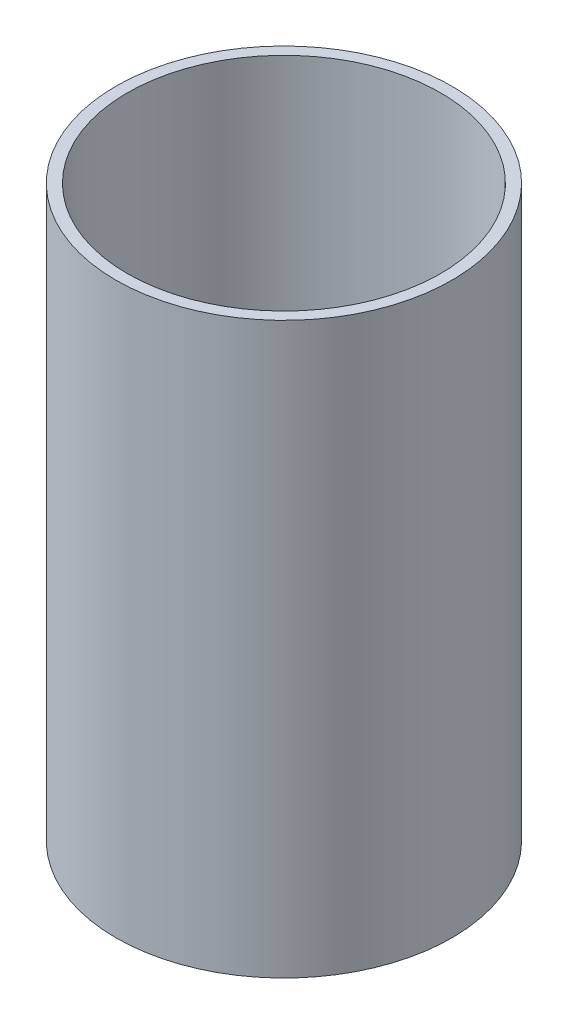
ISO-10303-21;
HEADER;
FILE_DESCRIPTION(('STEP AP214'),'2;1');
FILE_NAME('part.step','',(''),(''),'','','');
FILE_SCHEMA(('AUTOMOTIVE_DESIGN { 1 0 10303 214 1 1 1 1 }'));
ENDSEC;
DATA;
#1=APPLICATION_CONTEXT('core data for automotive mechanical design processes');
#2=APPLICATION_PROTOCOL_DEFINITION('international standard','automotive_design',2000,#1);
#3=PRODUCT_CONTEXT('',#1,'mechanical');
#4=PRODUCT('Part','Part','',(#3));
#5=PRODUCT_RELATED_PRODUCT_CATEGORY('part','',(#4));
#6=PRODUCT_DEFINITION_FORMATION('','',#4);
#7=PRODUCT_DEFINITION_CONTEXT('part definition',#1,'design');
#8=PRODUCT_DEFINITION('design','',#6,#7);
#9=PRODUCT_DEFINITION_SHAPE('','',#8);
#10=(LENGTH_UNIT() NAMED_UNIT(*) SI_UNIT(.MILLI.,.METRE.));
#11=(NAMED_UNIT(*) PLANE_ANGLE_UNIT() SI_UNIT($,.RADIAN.));
#12=(NAMED_UNIT(*) SI_UNIT($,.STERADIAN.) SOLID_ANGLE_UNIT());
#13=UNCERTAINTY_MEASURE_WITH_UNIT(LENGTH_MEASURE(1.E-05),#10,'distance_accuracy_value','');
#14=(GEOMETRIC_REPRESENTATION_CONTEXT(3) GLOBAL_UNCERTAINTY_ASSIGNED_CONTEXT((#13)) GLOBAL_UNIT_ASSIGNED_CONTEXT((#10,
#11,#12)) REPRESENTATION_CONTEXT('',''));
#15=CARTESIAN_POINT('',(0.,0.,0.));
#16=DIRECTION('',(0.,0.,1.));
#17=DIRECTION('',(1.,0.,0.));
#18=AXIS2_PLACEMENT_3D('',#15,#16,#17);
#19=CARTESIAN_POINT('',(0.,127.,0.));
#20=DIRECTION('',(0.,1.,0.));
#21=DIRECTION('',(0.,0.,1.));
#22=AXIS2_PLACEMENT_3D('',#19,#20,#21);
#23=PLANE('',#22);
#24=CARTESIAN_POINT('',(0.,127.,0.));
#25=DIRECTION('',(0.,1.,0.));
#26=DIRECTION('',(0.,0.,1.));
#27=AXIS2_PLACEMENT_3D('',#24,#25,#26);
#28=CIRCLE('',#27,37.465);
#29=CARTESIAN_POINT('',(0.,127.,37.465));
#30=VERTEX_POINT('',#29);
#31=EDGE_CURVE('E10',#30,#30,#28,.T.);
#32=ORIENTED_EDGE('',*,*,#31,.T.);
#33=EDGE_LOOP('',(#32));
#34=FACE_BOUND('',#33,.T.);
#35=CARTESIAN_POINT('',(0.,127.,0.));
#36=DIRECTION('',(0.,1.,0.));
#37=DIRECTION('',(0.,0.,1.));
#38=AXIS2_PLACEMENT_3D('',#35,#36,#37);
#39=CIRCLE('',#38,34.925);
#40=CARTESIAN_POINT('',(0.,127.,34.925));
#41=VERTEX_POINT('',#40);
#42=EDGE_CURVE('E46',#41,#41,#39,.T.);
#43=ORIENTED_EDGE('',*,*,#42,.F.);
#44=EDGE_LOOP('',(#43));
#45=FACE_BOUND('',#44,.T.);
#46=ADVANCED_FACE('F35',(#34,#45),#23,.T.);
#47=CARTESIAN_POINT('',(0.,0.,0.));
#48=DIRECTION('',(0.,1.,0.));
#49=DIRECTION('',(0.,0.,1.));
#50=AXIS2_PLACEMENT_3D('',#47,#48,#49);
#51=PLANE('',#50);
#52=CARTESIAN_POINT('',(0.,0.,0.));
#53=DIRECTION('',(0.,1.,0.));
#54=DIRECTION('',(0.,0.,1.));
#55=AXIS2_PLACEMENT_3D('',#52,#53,#54);
#56=CIRCLE('',#55,37.465);
#57=CARTESIAN_POINT('',(0.,0.,37.465));
#58=VERTEX_POINT('',#57);
#59=EDGE_CURVE('E39',#58,#58,#56,.T.);
#60=ORIENTED_EDGE('',*,*,#59,.F.);
#61=EDGE_LOOP('',(#60));
#62=FACE_BOUND('',#61,.T.);
#63=CARTESIAN_POINT('',(0.,0.,0.));
#64=DIRECTION('',(0.,1.,0.));
#65=DIRECTION('',(0.,0.,1.));
#66=AXIS2_PLACEMENT_3D('',#63,#64,#65);
#67=CIRCLE('',#66,34.925);
#68=CARTESIAN_POINT('',(0.,0.,34.925));
#69=VERTEX_POINT('',#68);
#70=EDGE_CURVE('E48',#69,#69,#67,.T.);
#71=ORIENTED_EDGE('',*,*,#70,.T.);
#72=EDGE_LOOP('',(#71));
#73=FACE_BOUND('',#72,.T.);
#74=ADVANCED_FACE('F58',(#62,#73),#51,.F.);
#75=CARTESIAN_POINT('',(0.,127.,0.));
#76=DIRECTION('',(0.,-1.,0.));
#77=DIRECTION('',(0.,0.,-1.));
#78=AXIS2_PLACEMENT_3D('',#75,#76,#77);
#79=CYLINDRICAL_SURFACE('',#78,37.465);
#80=ORIENTED_EDGE('',*,*,#31,.F.);
#81=EDGE_LOOP('',(#80));
#82=FACE_BOUND('',#81,.T.);
#83=ORIENTED_EDGE('',*,*,#59,.T.);
#84=EDGE_LOOP('',(#83));
#85=FACE_BOUND('',#84,.T.);
#86=ADVANCED_FACE('F37',(#82,#85),#79,.T.);
#87=CARTESIAN_POINT('',(0.,127.,0.));
#88=DIRECTION('',(0.,-1.,0.));
#89=DIRECTION('',(0.,0.,-1.));
#90=AXIS2_PLACEMENT_3D('',#87,#88,#89);
#91=CYLINDRICAL_SURFACE('',#90,34.925);
#92=ORIENTED_EDGE('',*,*,#42,.T.);
#93=EDGE_LOOP('',(#92));
#94=FACE_BOUND('',#93,.T.);
#95=ORIENTED_EDGE('',*,*,#70,.F.);
#96=EDGE_LOOP('',(#95));
#97=FACE_BOUND('',#96,.T.);
#98=ADVANCED_FACE('F54',(#94,#97),#91,.F.);
#99=CLOSED_SHELL('',(#46,#74,#86,#98));
#100=MANIFOLD_SOLID_BREP('B2',#99);
#101=ADVANCED_BREP_SHAPE_REPRESENTATION('',(#18,#100),#14);
#102=SHAPE_DEFINITION_REPRESENTATION(#9,#101);
ENDSEC;
END-ISO-10303-21;
